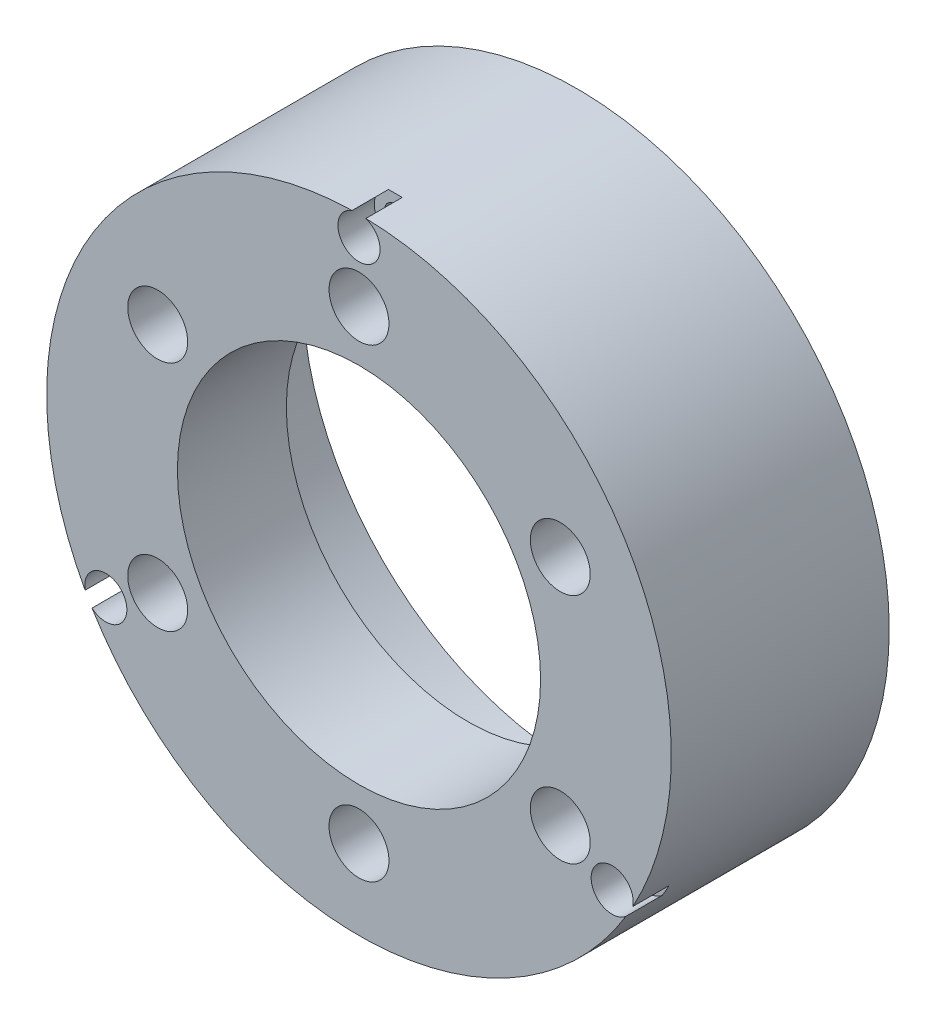
ISO-10303-21;
HEADER;
FILE_DESCRIPTION(('STEP AP214'),'2;1');
FILE_NAME('part.step','',(''),(''),'','','');
FILE_SCHEMA(('AUTOMOTIVE_DESIGN { 1 0 10303 214 1 1 1 1 }'));
ENDSEC;
DATA;
#1=APPLICATION_CONTEXT('core data for automotive mechanical design processes');
#2=APPLICATION_PROTOCOL_DEFINITION('international standard','automotive_design',2000,#1);
#3=PRODUCT_CONTEXT('',#1,'mechanical');
#4=PRODUCT('Part','Part','',(#3));
#5=PRODUCT_RELATED_PRODUCT_CATEGORY('part','',(#4));
#6=PRODUCT_DEFINITION_FORMATION('','',#4);
#7=PRODUCT_DEFINITION_CONTEXT('part definition',#1,'design');
#8=PRODUCT_DEFINITION('design','',#6,#7);
#9=PRODUCT_DEFINITION_SHAPE('','',#8);
#10=(LENGTH_UNIT() NAMED_UNIT(*) SI_UNIT(.MILLI.,.METRE.));
#11=(NAMED_UNIT(*) PLANE_ANGLE_UNIT() SI_UNIT($,.RADIAN.));
#12=(NAMED_UNIT(*) SI_UNIT($,.STERADIAN.) SOLID_ANGLE_UNIT());
#13=UNCERTAINTY_MEASURE_WITH_UNIT(LENGTH_MEASURE(1.E-05),#10,'distance_accuracy_value','');
#14=(GEOMETRIC_REPRESENTATION_CONTEXT(3) GLOBAL_UNCERTAINTY_ASSIGNED_CONTEXT((#13)) GLOBAL_UNIT_ASSIGNED_CONTEXT((#10,
#11,#12)) REPRESENTATION_CONTEXT('',''));
#15=CARTESIAN_POINT('',(0.,0.,0.));
#16=DIRECTION('',(0.,0.,1.));
#17=DIRECTION('',(1.,0.,0.));
#18=AXIS2_PLACEMENT_3D('',#15,#16,#17);
#19=CARTESIAN_POINT('',(0.,0.,30.));
#20=DIRECTION('',(0.,0.,-1.));
#21=DIRECTION('',(-1.,0.,0.));
#22=AXIS2_PLACEMENT_3D('',#19,#20,#21);
#23=CYLINDRICAL_SURFACE('',#22,25.);
#24=CARTESIAN_POINT('',(0.,0.,30.));
#25=DIRECTION('',(0.,0.,1.));
#26=DIRECTION('',(1.,0.,0.));
#27=AXIS2_PLACEMENT_3D('',#24,#25,#26);
#28=CIRCLE('',#27,25.);
#29=CARTESIAN_POINT('',(25.,0.,30.));
#30=VERTEX_POINT('',#29);
#31=EDGE_CURVE('E102',#30,#30,#28,.T.);
#32=ORIENTED_EDGE('',*,*,#31,.T.);
#33=EDGE_LOOP('',(#32));
#34=FACE_BOUND('',#33,.T.);
#35=CARTESIAN_POINT('',(0.,0.,15.));
#36=DIRECTION('',(0.,0.,-1.));
#37=DIRECTION('',(-1.,0.,0.));
#38=AXIS2_PLACEMENT_3D('',#35,#36,#37);
#39=CIRCLE('',#38,25.);
#40=CARTESIAN_POINT('',(-25.,0.,15.));
#41=VERTEX_POINT('',#40);
#42=EDGE_CURVE('E245',#41,#41,#39,.T.);
#43=ORIENTED_EDGE('',*,*,#42,.T.);
#44=EDGE_LOOP('',(#43));
#45=FACE_BOUND('',#44,.T.);
#46=ADVANCED_FACE('F17',(#34,#45),#23,.F.);
#47=CARTESIAN_POINT('',(-27.7128129211021,16.,0.));
#48=DIRECTION('',(0.,0.,1.));
#49=DIRECTION('',(1.,0.,0.));
#50=AXIS2_PLACEMENT_3D('',#47,#48,#49);
#51=CYLINDRICAL_SURFACE('',#50,4.125);
#52=CARTESIAN_POINT('',(-27.7128129211021,16.,30.));
#53=DIRECTION('',(0.,0.,1.));
#54=DIRECTION('',(1.,0.,0.));
#55=AXIS2_PLACEMENT_3D('',#52,#53,#54);
#56=CIRCLE('',#55,4.125);
#57=CARTESIAN_POINT('',(-23.5878129211021,16.,30.));
#58=VERTEX_POINT('',#57);
#59=EDGE_CURVE('E84',#58,#58,#56,.T.);
#60=ORIENTED_EDGE('',*,*,#59,.T.);
#61=EDGE_LOOP('',(#60));
#62=FACE_BOUND('',#61,.T.);
#63=CARTESIAN_POINT('',(-27.7128129211021,16.,15.));
#64=DIRECTION('',(0.,0.,-1.));
#65=DIRECTION('',(-1.,0.,0.));
#66=AXIS2_PLACEMENT_3D('',#63,#64,#65);
#67=CIRCLE('',#66,4.125);
#68=CARTESIAN_POINT('',(-31.8378129211021,16.,15.));
#69=VERTEX_POINT('',#68);
#70=EDGE_CURVE('E258',#69,#69,#67,.F.);
#71=ORIENTED_EDGE('',*,*,#70,.F.);
#72=EDGE_LOOP('',(#71));
#73=FACE_BOUND('',#72,.T.);
#74=ADVANCED_FACE('F154',(#62,#73),#51,.F.);
#75=CARTESIAN_POINT('',(-1.89948579573515E-12,32.0000000000031,0.));
#76=DIRECTION('',(0.,0.,1.));
#77=DIRECTION('',(1.,0.,0.));
#78=AXIS2_PLACEMENT_3D('',#75,#76,#77);
#79=CYLINDRICAL_SURFACE('',#78,4.12500000000352);
#80=CARTESIAN_POINT('',(-1.89948579573515E-12,32.0000000000031,30.));
#81=DIRECTION('',(0.,0.,1.));
#82=DIRECTION('',(1.,0.,0.));
#83=AXIS2_PLACEMENT_3D('',#80,#81,#82);
#84=CIRCLE('',#83,4.12500000000352);
#85=CARTESIAN_POINT('',(4.12500000000162,32.0000000000031,30.));
#86=VERTEX_POINT('',#85);
#87=EDGE_CURVE('E240',#86,#86,#84,.T.);
#88=ORIENTED_EDGE('',*,*,#87,.T.);
#89=EDGE_LOOP('',(#88));
#90=FACE_BOUND('',#89,.T.);
#91=CARTESIAN_POINT('',(-1.89948579573515E-12,32.0000000000031,15.));
#92=DIRECTION('',(0.,0.,-1.));
#93=DIRECTION('',(-1.,0.,0.));
#94=AXIS2_PLACEMENT_3D('',#91,#92,#93);
#95=CIRCLE('',#94,4.12500000000352);
#96=CARTESIAN_POINT('',(-4.12500000000542,32.0000000000031,15.));
#97=VERTEX_POINT('',#96);
#98=EDGE_CURVE('E261',#97,#97,#95,.F.);
#99=ORIENTED_EDGE('',*,*,#98,.F.);
#100=EDGE_LOOP('',(#99));
#101=FACE_BOUND('',#100,.T.);
#102=ADVANCED_FACE('F161',(#90,#101),#79,.F.);
#103=CARTESIAN_POINT('',(27.712812921102,16.0000000000063,0.));
#104=DIRECTION('',(0.,0.,1.));
#105=DIRECTION('',(1.,0.,0.));
#106=AXIS2_PLACEMENT_3D('',#103,#104,#105);
#107=CYLINDRICAL_SURFACE('',#106,4.12500000000624);
#108=CARTESIAN_POINT('',(27.712812921102,16.0000000000063,30.));
#109=DIRECTION('',(0.,0.,1.));
#110=DIRECTION('',(1.,0.,0.));
#111=AXIS2_PLACEMENT_3D('',#108,#109,#110);
#112=CIRCLE('',#111,4.12500000000624);
#113=CARTESIAN_POINT('',(31.8378129211082,16.0000000000063,30.));
#114=VERTEX_POINT('',#113);
#115=EDGE_CURVE('E251',#114,#114,#112,.T.);
#116=ORIENTED_EDGE('',*,*,#115,.T.);
#117=EDGE_LOOP('',(#116));
#118=FACE_BOUND('',#117,.T.);
#119=CARTESIAN_POINT('',(27.712812921102,16.0000000000063,15.));
#120=DIRECTION('',(0.,0.,-1.));
#121=DIRECTION('',(-1.,0.,0.));
#122=AXIS2_PLACEMENT_3D('',#119,#120,#121);
#123=CIRCLE('',#122,4.12500000000624);
#124=CARTESIAN_POINT('',(23.5878129210958,16.0000000000063,15.));
#125=VERTEX_POINT('',#124);
#126=EDGE_CURVE('E264',#125,#125,#123,.F.);
#127=ORIENTED_EDGE('',*,*,#126,.F.);
#128=EDGE_LOOP('',(#127));
#129=FACE_BOUND('',#128,.T.);
#130=ADVANCED_FACE('F287',(#118,#129),#107,.F.);
#131=CARTESIAN_POINT('',(27.7128129211057,-15.9999999999936,0.));
#132=DIRECTION('',(0.,0.,1.));
#133=DIRECTION('',(1.,0.,0.));
#134=AXIS2_PLACEMENT_3D('',#131,#132,#133);
#135=CYLINDRICAL_SURFACE('',#134,4.12500000000547);
#136=CARTESIAN_POINT('',(27.7128129211057,-15.9999999999936,30.));
#137=DIRECTION('',(0.,0.,1.));
#138=DIRECTION('',(1.,0.,0.));
#139=AXIS2_PLACEMENT_3D('',#136,#137,#138);
#140=CIRCLE('',#139,4.12500000000547);
#141=CARTESIAN_POINT('',(31.8378129211112,-15.9999999999936,30.));
#142=VERTEX_POINT('',#141);
#143=EDGE_CURVE('E248',#142,#142,#140,.T.);
#144=ORIENTED_EDGE('',*,*,#143,.T.);
#145=EDGE_LOOP('',(#144));
#146=FACE_BOUND('',#145,.T.);
#147=CARTESIAN_POINT('',(27.7128129211057,-15.9999999999936,15.));
#148=DIRECTION('',(0.,0.,-1.));
#149=DIRECTION('',(-1.,0.,0.));
#150=AXIS2_PLACEMENT_3D('',#147,#148,#149);
#151=CIRCLE('',#150,4.12500000000547);
#152=CARTESIAN_POINT('',(23.5878129211002,-15.9999999999936,15.));
#153=VERTEX_POINT('',#152);
#154=EDGE_CURVE('E267',#153,#153,#151,.F.);
#155=ORIENTED_EDGE('',*,*,#154,.F.);
#156=EDGE_LOOP('',(#155));
#157=FACE_BOUND('',#156,.T.);
#158=ADVANCED_FACE('F277',(#146,#157),#135,.F.);
#159=CARTESIAN_POINT('',(5.53619799844328E-12,-31.9999999999969,0.));
#160=DIRECTION('',(0.,0.,1.));
#161=DIRECTION('',(1.,0.,0.));
#162=AXIS2_PLACEMENT_3D('',#159,#160,#161);
#163=CYLINDRICAL_SURFACE('',#162,4.12500000000207);
#164=CARTESIAN_POINT('',(5.53619799844328E-12,-31.9999999999969,30.));
#165=DIRECTION('',(0.,0.,1.));
#166=DIRECTION('',(1.,0.,0.));
#167=AXIS2_PLACEMENT_3D('',#164,#165,#166);
#168=CIRCLE('',#167,4.12500000000207);
#169=CARTESIAN_POINT('',(4.12500000000761,-31.9999999999969,30.));
#170=VERTEX_POINT('',#169);
#171=EDGE_CURVE('E244',#170,#170,#168,.T.);
#172=ORIENTED_EDGE('',*,*,#171,.T.);
#173=EDGE_LOOP('',(#172));
#174=FACE_BOUND('',#173,.T.);
#175=CARTESIAN_POINT('',(5.53619799844328E-12,-31.9999999999969,15.));
#176=DIRECTION('',(0.,0.,-1.));
#177=DIRECTION('',(-1.,0.,0.));
#178=AXIS2_PLACEMENT_3D('',#175,#176,#177);
#179=CIRCLE('',#178,4.12500000000207);
#180=CARTESIAN_POINT('',(-4.12499999999654,-31.9999999999969,15.));
#181=VERTEX_POINT('',#180);
#182=EDGE_CURVE('E136',#181,#181,#179,.F.);
#183=ORIENTED_EDGE('',*,*,#182,.F.);
#184=EDGE_LOOP('',(#183));
#185=FACE_BOUND('',#184,.T.);
#186=ADVANCED_FACE('F275',(#174,#185),#163,.F.);
#187=CARTESIAN_POINT('',(-27.7128129210984,-16.,0.));
#188=DIRECTION('',(0.,0.,1.));
#189=DIRECTION('',(1.,0.,0.));
#190=AXIS2_PLACEMENT_3D('',#187,#188,#189);
#191=CYLINDRICAL_SURFACE('',#190,4.12499999999948);
#192=CARTESIAN_POINT('',(-27.7128129210984,-16.,30.));
#193=DIRECTION('',(0.,0.,1.));
#194=DIRECTION('',(1.,0.,0.));
#195=AXIS2_PLACEMENT_3D('',#192,#193,#194);
#196=CIRCLE('',#195,4.12499999999948);
#197=CARTESIAN_POINT('',(-23.5878129210989,-16.,30.));
#198=VERTEX_POINT('',#197);
#199=EDGE_CURVE('E241',#198,#198,#196,.T.);
#200=ORIENTED_EDGE('',*,*,#199,.T.);
#201=EDGE_LOOP('',(#200));
#202=FACE_BOUND('',#201,.T.);
#203=CARTESIAN_POINT('',(-27.7128129210984,-16.,15.));
#204=DIRECTION('',(0.,0.,-1.));
#205=DIRECTION('',(-1.,0.,0.));
#206=AXIS2_PLACEMENT_3D('',#203,#204,#205);
#207=CIRCLE('',#206,4.12499999999948);
#208=CARTESIAN_POINT('',(-31.8378129210978,-16.,15.));
#209=VERTEX_POINT('',#208);
#210=EDGE_CURVE('E134',#209,#209,#207,.F.);
#211=ORIENTED_EDGE('',*,*,#210,.F.);
#212=EDGE_LOOP('',(#211));
#213=FACE_BOUND('',#212,.T.);
#214=ADVANCED_FACE('F185',(#202,#213),#191,.F.);
#215=CARTESIAN_POINT('',(0.,40.25,10.));
#216=DIRECTION('',(0.,0.,-1.));
#217=DIRECTION('',(-1.,0.,0.));
#218=AXIS2_PLACEMENT_3D('',#215,#216,#217);
#219=CYLINDRICAL_SURFACE('',#218,1.5);
#220=CARTESIAN_POINT('',(0.,40.25,0.));
#221=DIRECTION('',(0.,0.,1.));
#222=DIRECTION('',(1.,0.,0.));
#223=AXIS2_PLACEMENT_3D('',#220,#221,#222);
#224=CIRCLE('',#223,1.5);
#225=CARTESIAN_POINT('',(1.5,40.25,0.));
#226=VERTEX_POINT('',#225);
#227=EDGE_CURVE('E116',#226,#226,#224,.T.);
#228=ORIENTED_EDGE('',*,*,#227,.F.);
#229=EDGE_LOOP('',(#228));
#230=FACE_BOUND('',#229,.T.);
#231=CARTESIAN_POINT('',(0.,40.25,25.));
#232=DIRECTION('',(0.,0.,1.));
#233=DIRECTION('',(1.,0.,0.));
#234=AXIS2_PLACEMENT_3D('',#231,#232,#233);
#235=CIRCLE('',#234,1.5);
#236=CARTESIAN_POINT('',(1.5,40.25,25.));
#237=VERTEX_POINT('',#236);
#238=EDGE_CURVE('E89',#237,#237,#235,.T.);
#239=ORIENTED_EDGE('',*,*,#238,.T.);
#240=EDGE_LOOP('',(#239));
#241=FACE_BOUND('',#240,.T.);
#242=ADVANCED_FACE('F181',(#230,#241),#219,.F.);
#243=CARTESIAN_POINT('',(-34.8575225023236,-20.125,10.));
#244=DIRECTION('',(0.,0.,-1.));
#245=DIRECTION('',(-1.,0.,0.));
#246=AXIS2_PLACEMENT_3D('',#243,#244,#245);
#247=CYLINDRICAL_SURFACE('',#246,1.5);
#248=CARTESIAN_POINT('',(-34.8575225023236,-20.125,0.));
#249=DIRECTION('',(0.,0.,1.));
#250=DIRECTION('',(1.,0.,0.));
#251=AXIS2_PLACEMENT_3D('',#248,#249,#250);
#252=CIRCLE('',#251,1.5);
#253=CARTESIAN_POINT('',(-33.3575225023236,-20.125,0.));
#254=VERTEX_POINT('',#253);
#255=EDGE_CURVE('E113',#254,#254,#252,.T.);
#256=ORIENTED_EDGE('',*,*,#255,.F.);
#257=EDGE_LOOP('',(#256));
#258=FACE_BOUND('',#257,.T.);
#259=CARTESIAN_POINT('',(-34.8575225023236,-20.125,25.));
#260=DIRECTION('',(0.,0.,1.));
#261=DIRECTION('',(1.,0.,0.));
#262=AXIS2_PLACEMENT_3D('',#259,#260,#261);
#263=CIRCLE('',#262,1.5);
#264=CARTESIAN_POINT('',(-33.3575225023236,-20.125,25.));
#265=VERTEX_POINT('',#264);
#266=EDGE_CURVE('E90',#265,#265,#263,.T.);
#267=ORIENTED_EDGE('',*,*,#266,.T.);
#268=EDGE_LOOP('',(#267));
#269=FACE_BOUND('',#268,.T.);
#270=ADVANCED_FACE('F177',(#258,#269),#247,.F.);
#271=CARTESIAN_POINT('',(34.8575225023236,-20.125,10.));
#272=DIRECTION('',(0.,0.,-1.));
#273=DIRECTION('',(-1.,0.,0.));
#274=AXIS2_PLACEMENT_3D('',#271,#272,#273);
#275=CYLINDRICAL_SURFACE('',#274,1.5);
#276=CARTESIAN_POINT('',(34.8575225023236,-20.125,0.));
#277=DIRECTION('',(0.,0.,1.));
#278=DIRECTION('',(1.,0.,0.));
#279=AXIS2_PLACEMENT_3D('',#276,#277,#278);
#280=CIRCLE('',#279,1.5);
#281=CARTESIAN_POINT('',(36.3575225023236,-20.125,0.));
#282=VERTEX_POINT('',#281);
#283=EDGE_CURVE('E110',#282,#282,#280,.T.);
#284=ORIENTED_EDGE('',*,*,#283,.F.);
#285=EDGE_LOOP('',(#284));
#286=FACE_BOUND('',#285,.T.);
#287=CARTESIAN_POINT('',(34.8575225023236,-20.125,25.));
#288=DIRECTION('',(0.,0.,1.));
#289=DIRECTION('',(1.,0.,0.));
#290=AXIS2_PLACEMENT_3D('',#287,#288,#289);
#291=CIRCLE('',#290,1.5);
#292=CARTESIAN_POINT('',(36.3575225023236,-20.125,25.));
#293=VERTEX_POINT('',#292);
#294=EDGE_CURVE('E130',#293,#293,#291,.T.);
#295=ORIENTED_EDGE('',*,*,#294,.T.);
#296=EDGE_LOOP('',(#295));
#297=FACE_BOUND('',#296,.T.);
#298=ADVANCED_FACE('F173',(#286,#297),#275,.F.);
#299=CARTESIAN_POINT('',(0.,0.,0.));
#300=DIRECTION('',(0.,0.,1.));
#301=DIRECTION('',(1.,0.,0.));
#302=AXIS2_PLACEMENT_3D('',#299,#300,#301);
#303=PLANE('',#302);
#304=CARTESIAN_POINT('',(0.,0.,0.));
#305=DIRECTION('',(0.,0.,1.));
#306=DIRECTION('',(1.,0.,0.));
#307=AXIS2_PLACEMENT_3D('',#304,#305,#306);
#308=CIRCLE('',#307,43.);
#309=CARTESIAN_POINT('',(43.,0.,0.));
#310=VERTEX_POINT('',#309);
#311=EDGE_CURVE('E122',#310,#310,#308,.T.);
#312=ORIENTED_EDGE('',*,*,#311,.F.);
#313=EDGE_LOOP('',(#312));
#314=FACE_BOUND('',#313,.T.);
#315=CARTESIAN_POINT('',(0.,0.,0.));
#316=DIRECTION('',(0.,0.,1.));
#317=DIRECTION('',(1.,0.,0.));
#318=AXIS2_PLACEMENT_3D('',#315,#316,#317);
#319=CIRCLE('',#318,37.75);
#320=CARTESIAN_POINT('',(37.75,0.,0.));
#321=VERTEX_POINT('',#320);
#322=EDGE_CURVE('E119',#321,#321,#319,.T.);
#323=ORIENTED_EDGE('',*,*,#322,.T.);
#324=EDGE_LOOP('',(#323));
#325=FACE_BOUND('',#324,.T.);
#326=ORIENTED_EDGE('',*,*,#227,.T.);
#327=EDGE_LOOP('',(#326));
#328=FACE_BOUND('',#327,.T.);
#329=ORIENTED_EDGE('',*,*,#255,.T.);
#330=EDGE_LOOP('',(#329));
#331=FACE_BOUND('',#330,.T.);
#332=ORIENTED_EDGE('',*,*,#283,.T.);
#333=EDGE_LOOP('',(#332));
#334=FACE_BOUND('',#333,.T.);
#335=ADVANCED_FACE('F176',(#314,#325,#328,#331,#334),#303,.F.);
#336=CARTESIAN_POINT('',(0.,0.,10.));
#337=DIRECTION('',(0.,0.,-1.));
#338=DIRECTION('',(-1.,0.,0.));
#339=AXIS2_PLACEMENT_3D('',#336,#337,#338);
#340=CYLINDRICAL_SURFACE('',#339,43.);
#341=ORIENTED_EDGE('',*,*,#311,.T.);
#342=EDGE_LOOP('',(#341));
#343=FACE_BOUND('',#342,.T.);
#344=CARTESIAN_POINT('',(0.,0.,25.));
#345=DIRECTION('',(0.,0.,1.));
#346=DIRECTION('',(1.,0.,0.));
#347=AXIS2_PLACEMENT_3D('',#344,#345,#346);
#348=CIRCLE('',#347,43.);
#349=CARTESIAN_POINT('',(0.951468806094219,42.9894720496894,25.));
#350=VERTEX_POINT('',#349);
#351=CARTESIAN_POINT('',(-0.951468806094219,42.9894720496894,25.));
#352=VERTEX_POINT('',#351);
#353=EDGE_CURVE('E93',#350,#352,#348,.T.);
#354=ORIENTED_EDGE('',*,*,#353,.F.);
#355=DIRECTION('',(0.,0.,1.));
#356=VECTOR('',#355,1.);
#357=CARTESIAN_POINT('',(0.951468806094389,42.9894720496894,27.5));
#358=LINE('',#357,#356);
#359=CARTESIAN_POINT('',(0.951468806094389,42.9894720496894,30.));
#360=VERTEX_POINT('',#359);
#361=EDGE_CURVE('E132',#350,#360,#358,.T.);
#362=ORIENTED_EDGE('',*,*,#361,.T.);
#363=CARTESIAN_POINT('',(0.,0.,30.));
#364=DIRECTION('',(0.,0.,1.));
#365=DIRECTION('',(1.,0.,0.));
#366=AXIS2_PLACEMENT_3D('',#363,#364,#365);
#367=CIRCLE('',#366,43.);
#368=CARTESIAN_POINT('',(37.7057092933592,-20.6707398678587,30.));
#369=VERTEX_POINT('',#368);
#370=EDGE_CURVE('E105',#369,#360,#367,.T.);
#371=ORIENTED_EDGE('',*,*,#370,.F.);
#372=DIRECTION('',(0.,0.,1.));
#373=VECTOR('',#372,1.);
#374=CARTESIAN_POINT('',(37.7057092933592,-20.6707398678587,27.5));
#375=LINE('',#374,#373);
#376=CARTESIAN_POINT('',(37.7057092933591,-20.6707398678588,25.));
#377=VERTEX_POINT('',#376);
#378=EDGE_CURVE('E32',#369,#377,#375,.F.);
#379=ORIENTED_EDGE('',*,*,#378,.T.);
#380=CARTESIAN_POINT('',(0.,0.,25.));
#381=DIRECTION('',(0.,0.,1.));
#382=DIRECTION('',(1.,0.,0.));
#383=AXIS2_PLACEMENT_3D('',#380,#381,#382);
#384=CIRCLE('',#383,43.);
#385=CARTESIAN_POINT('',(36.7542404872649,-22.3187321818309,25.));
#386=VERTEX_POINT('',#385);
#387=EDGE_CURVE('E96',#386,#377,#384,.T.);
#388=ORIENTED_EDGE('',*,*,#387,.F.);
#389=DIRECTION('',(0.,0.,1.));
#390=VECTOR('',#389,1.);
#391=CARTESIAN_POINT('',(36.7542404872648,-22.318732181831,27.5));
#392=LINE('',#391,#390);
#393=CARTESIAN_POINT('',(36.7542404872648,-22.318732181831,30.));
#394=VERTEX_POINT('',#393);
#395=EDGE_CURVE('E217',#386,#394,#392,.T.);
#396=ORIENTED_EDGE('',*,*,#395,.T.);
#397=CARTESIAN_POINT('',(-36.7542404872648,-22.3187321818311,30.));
#398=VERTEX_POINT('',#397);
#399=EDGE_CURVE('E108',#398,#394,#367,.T.);
#400=ORIENTED_EDGE('',*,*,#399,.F.);
#401=DIRECTION('',(0.,0.,1.));
#402=VECTOR('',#401,1.);
#403=CARTESIAN_POINT('',(-36.7542404872648,-22.318732181831,27.5));
#404=LINE('',#403,#402);
#405=CARTESIAN_POINT('',(-36.754240487265,-22.3187321818309,25.));
#406=VERTEX_POINT('',#405);
#407=EDGE_CURVE('E40',#398,#406,#404,.F.);
#408=ORIENTED_EDGE('',*,*,#407,.T.);
#409=CARTESIAN_POINT('',(0.,0.,25.));
#410=DIRECTION('',(0.,0.,1.));
#411=DIRECTION('',(1.,0.,0.));
#412=AXIS2_PLACEMENT_3D('',#409,#410,#411);
#413=CIRCLE('',#412,43.);
#414=CARTESIAN_POINT('',(-37.7057092933591,-20.6707398678589,25.));
#415=VERTEX_POINT('',#414);
#416=EDGE_CURVE('E82',#415,#406,#413,.T.);
#417=ORIENTED_EDGE('',*,*,#416,.F.);
#418=DIRECTION('',(0.,0.,1.));
#419=VECTOR('',#418,1.);
#420=CARTESIAN_POINT('',(-37.7057092933592,-20.6707398678587,27.5));
#421=LINE('',#420,#419);
#422=CARTESIAN_POINT('',(-37.7057092933592,-20.6707398678587,30.));
#423=VERTEX_POINT('',#422);
#424=EDGE_CURVE('E70',#415,#423,#421,.T.);
#425=ORIENTED_EDGE('',*,*,#424,.T.);
#426=CARTESIAN_POINT('',(-0.951468806094408,42.9894720496894,30.));
#427=VERTEX_POINT('',#426);
#428=EDGE_CURVE('E109',#427,#423,#367,.T.);
#429=ORIENTED_EDGE('',*,*,#428,.F.);
#430=DIRECTION('',(0.,0.,1.));
#431=VECTOR('',#430,1.);
#432=CARTESIAN_POINT('',(-0.951468806094389,42.9894720496894,27.5));
#433=LINE('',#432,#431);
#434=EDGE_CURVE('E223',#427,#352,#433,.F.);
#435=ORIENTED_EDGE('',*,*,#434,.T.);
#436=EDGE_LOOP('',(#354,#362,#371,#379,#388,#396,#400,#408,#417,#425,#429,#435));
#437=FACE_BOUND('',#436,.T.);
#438=ADVANCED_FACE('F87',(#343,#437),#340,.T.);
#439=CARTESIAN_POINT('',(0.,0.,10.));
#440=DIRECTION('',(0.,0.,-1.));
#441=DIRECTION('',(-1.,0.,0.));
#442=AXIS2_PLACEMENT_3D('',#439,#440,#441);
#443=CYLINDRICAL_SURFACE('',#442,37.75);
#444=CARTESIAN_POINT('',(0.,0.,14.));
#445=DIRECTION('',(0.,0.,-1.));
#446=DIRECTION('',(-1.,0.,0.));
#447=AXIS2_PLACEMENT_3D('',#444,#445,#446);
#448=CIRCLE('',#447,37.75);
#449=CARTESIAN_POINT('',(-37.75,0.,14.));
#450=VERTEX_POINT('',#449);
#451=EDGE_CURVE('E11',#450,#450,#448,.F.);
#452=ORIENTED_EDGE('',*,*,#451,.T.);
#453=EDGE_LOOP('',(#452));
#454=FACE_BOUND('',#453,.T.);
#455=ORIENTED_EDGE('',*,*,#322,.F.);
#456=EDGE_LOOP('',(#455));
#457=FACE_BOUND('',#456,.T.);
#458=ADVANCED_FACE('F171',(#454,#457),#443,.F.);
#459=CARTESIAN_POINT('',(0.,0.,30.));
#460=DIRECTION('',(0.,0.,1.));
#461=DIRECTION('',(1.,0.,0.));
#462=AXIS2_PLACEMENT_3D('',#459,#460,#461);
#463=PLANE('',#462);
#464=ORIENTED_EDGE('',*,*,#199,.F.);
#465=EDGE_LOOP('',(#464));
#466=FACE_BOUND('',#465,.T.);
#467=ORIENTED_EDGE('',*,*,#171,.F.);
#468=EDGE_LOOP('',(#467));
#469=FACE_BOUND('',#468,.T.);
#470=ORIENTED_EDGE('',*,*,#143,.F.);
#471=EDGE_LOOP('',(#470));
#472=FACE_BOUND('',#471,.T.);
#473=ORIENTED_EDGE('',*,*,#115,.F.);
#474=EDGE_LOOP('',(#473));
#475=FACE_BOUND('',#474,.T.);
#476=ORIENTED_EDGE('',*,*,#87,.F.);
#477=EDGE_LOOP('',(#476));
#478=FACE_BOUND('',#477,.T.);
#479=ORIENTED_EDGE('',*,*,#59,.F.);
#480=EDGE_LOOP('',(#479));
#481=FACE_BOUND('',#480,.T.);
#482=CARTESIAN_POINT('',(0.,40.25,30.));
#483=DIRECTION('',(0.,0.,1.));
#484=DIRECTION('',(1.,0.,0.));
#485=AXIS2_PLACEMENT_3D('',#482,#483,#484);
#486=CIRCLE('',#485,2.9);
#487=EDGE_CURVE('E128',#427,#360,#486,.T.);
#488=ORIENTED_EDGE('',*,*,#487,.F.);
#489=ORIENTED_EDGE('',*,*,#428,.T.);
#490=CARTESIAN_POINT('',(-34.8575225023236,-20.125,30.));
#491=DIRECTION('',(0.,0.,1.));
#492=DIRECTION('',(1.,0.,0.));
#493=AXIS2_PLACEMENT_3D('',#490,#491,#492);
#494=CIRCLE('',#493,2.9);
#495=EDGE_CURVE('E74',#398,#423,#494,.T.);
#496=ORIENTED_EDGE('',*,*,#495,.F.);
#497=ORIENTED_EDGE('',*,*,#399,.T.);
#498=CARTESIAN_POINT('',(34.8575225023236,-20.125,30.));
#499=DIRECTION('',(0.,0.,1.));
#500=DIRECTION('',(1.,0.,0.));
#501=AXIS2_PLACEMENT_3D('',#498,#499,#500);
#502=CIRCLE('',#501,2.9);
#503=EDGE_CURVE('E126',#369,#394,#502,.T.);
#504=ORIENTED_EDGE('',*,*,#503,.F.);
#505=ORIENTED_EDGE('',*,*,#370,.T.);
#506=EDGE_LOOP('',(#488,#489,#496,#497,#504,#505));
#507=FACE_BOUND('',#506,.T.);
#508=ORIENTED_EDGE('',*,*,#31,.F.);
#509=EDGE_LOOP('',(#508));
#510=FACE_BOUND('',#509,.T.);
#511=ADVANCED_FACE('F168',(#466,#469,#472,#475,#478,#481,#507,#510),#463,.T.);
#512=CARTESIAN_POINT('',(-34.8575225023236,-20.125,25.));
#513=DIRECTION('',(0.,0.,1.));
#514=DIRECTION('',(1.,0.,0.));
#515=AXIS2_PLACEMENT_3D('',#512,#513,#514);
#516=PLANE('',#515);
#517=ORIENTED_EDGE('',*,*,#266,.F.);
#518=EDGE_LOOP('',(#517));
#519=FACE_BOUND('',#518,.T.);
#520=ORIENTED_EDGE('',*,*,#416,.T.);
#521=CARTESIAN_POINT('',(-34.8575225023236,-20.125,25.));
#522=DIRECTION('',(0.,0.,1.));
#523=DIRECTION('',(1.,0.,0.));
#524=AXIS2_PLACEMENT_3D('',#521,#522,#523);
#525=CIRCLE('',#524,2.9);
#526=EDGE_CURVE('E73',#406,#415,#525,.T.);
#527=ORIENTED_EDGE('',*,*,#526,.T.);
#528=EDGE_LOOP('',(#520,#527));
#529=FACE_BOUND('',#528,.T.);
#530=ADVANCED_FACE('F81',(#519,#529),#516,.T.);
#531=CARTESIAN_POINT('',(-34.8575225023236,-20.125,25.));
#532=DIRECTION('',(0.,0.,1.));
#533=DIRECTION('',(1.,0.,0.));
#534=AXIS2_PLACEMENT_3D('',#531,#532,#533);
#535=CYLINDRICAL_SURFACE('',#534,2.9);
#536=ORIENTED_EDGE('',*,*,#526,.F.);
#537=ORIENTED_EDGE('',*,*,#407,.F.);
#538=ORIENTED_EDGE('',*,*,#495,.T.);
#539=ORIENTED_EDGE('',*,*,#424,.F.);
#540=EDGE_LOOP('',(#536,#537,#538,#539));
#541=FACE_BOUND('',#540,.T.);
#542=ADVANCED_FACE('F72',(#541),#535,.F.);
#543=CARTESIAN_POINT('',(34.8575225023236,-20.125,25.));
#544=DIRECTION('',(0.,0.,1.));
#545=DIRECTION('',(1.,0.,0.));
#546=AXIS2_PLACEMENT_3D('',#543,#544,#545);
#547=PLANE('',#546);
#548=ORIENTED_EDGE('',*,*,#294,.F.);
#549=EDGE_LOOP('',(#548));
#550=FACE_BOUND('',#549,.T.);
#551=ORIENTED_EDGE('',*,*,#387,.T.);
#552=CARTESIAN_POINT('',(34.8575225023236,-20.125,25.));
#553=DIRECTION('',(0.,0.,1.));
#554=DIRECTION('',(1.,0.,0.));
#555=AXIS2_PLACEMENT_3D('',#552,#553,#554);
#556=CIRCLE('',#555,2.9);
#557=EDGE_CURVE('E83',#377,#386,#556,.T.);
#558=ORIENTED_EDGE('',*,*,#557,.T.);
#559=EDGE_LOOP('',(#551,#558));
#560=FACE_BOUND('',#559,.T.);
#561=ADVANCED_FACE('F209',(#550,#560),#547,.T.);
#562=CARTESIAN_POINT('',(34.8575225023236,-20.125,25.));
#563=DIRECTION('',(0.,0.,1.));
#564=DIRECTION('',(1.,0.,0.));
#565=AXIS2_PLACEMENT_3D('',#562,#563,#564);
#566=CYLINDRICAL_SURFACE('',#565,2.9);
#567=ORIENTED_EDGE('',*,*,#557,.F.);
#568=ORIENTED_EDGE('',*,*,#378,.F.);
#569=ORIENTED_EDGE('',*,*,#503,.T.);
#570=ORIENTED_EDGE('',*,*,#395,.F.);
#571=EDGE_LOOP('',(#567,#568,#569,#570));
#572=FACE_BOUND('',#571,.T.);
#573=ADVANCED_FACE('F212',(#572),#566,.F.);
#574=CARTESIAN_POINT('',(0.,40.25,25.));
#575=DIRECTION('',(0.,0.,1.));
#576=DIRECTION('',(1.,0.,0.));
#577=AXIS2_PLACEMENT_3D('',#574,#575,#576);
#578=PLANE('',#577);
#579=ORIENTED_EDGE('',*,*,#238,.F.);
#580=EDGE_LOOP('',(#579));
#581=FACE_BOUND('',#580,.T.);
#582=ORIENTED_EDGE('',*,*,#353,.T.);
#583=CARTESIAN_POINT('',(0.,40.25,25.));
#584=DIRECTION('',(0.,0.,1.));
#585=DIRECTION('',(1.,0.,0.));
#586=AXIS2_PLACEMENT_3D('',#583,#584,#585);
#587=CIRCLE('',#586,2.9);
#588=EDGE_CURVE('E218',#352,#350,#587,.T.);
#589=ORIENTED_EDGE('',*,*,#588,.T.);
#590=EDGE_LOOP('',(#582,#589));
#591=FACE_BOUND('',#590,.T.);
#592=ADVANCED_FACE('F292',(#581,#591),#578,.T.);
#593=CARTESIAN_POINT('',(0.,40.25,25.));
#594=DIRECTION('',(0.,0.,1.));
#595=DIRECTION('',(1.,0.,0.));
#596=AXIS2_PLACEMENT_3D('',#593,#594,#595);
#597=CYLINDRICAL_SURFACE('',#596,2.9);
#598=ORIENTED_EDGE('',*,*,#588,.F.);
#599=ORIENTED_EDGE('',*,*,#434,.F.);
#600=ORIENTED_EDGE('',*,*,#487,.T.);
#601=ORIENTED_EDGE('',*,*,#361,.F.);
#602=EDGE_LOOP('',(#598,#599,#600,#601));
#603=FACE_BOUND('',#602,.T.);
#604=ADVANCED_FACE('F150',(#603),#597,.F.);
#605=CARTESIAN_POINT('',(0.,0.,15.));
#606=DIRECTION('',(0.,0.,-1.));
#607=DIRECTION('',(-1.,0.,0.));
#608=AXIS2_PLACEMENT_3D('',#605,#606,#607);
#609=PLANE('',#608);
#610=CARTESIAN_POINT('',(0.,0.,15.));
#611=DIRECTION('',(0.,0.,-1.));
#612=DIRECTION('',(-1.,0.,0.));
#613=AXIS2_PLACEMENT_3D('',#610,#611,#612);
#614=CIRCLE('',#613,36.75);
#615=CARTESIAN_POINT('',(-36.75,0.,15.));
#616=VERTEX_POINT('',#615);
#617=EDGE_CURVE('E25',#616,#616,#614,.T.);
#618=ORIENTED_EDGE('',*,*,#617,.T.);
#619=EDGE_LOOP('',(#618));
#620=FACE_BOUND('',#619,.T.);
#621=ORIENTED_EDGE('',*,*,#42,.F.);
#622=EDGE_LOOP('',(#621));
#623=FACE_BOUND('',#622,.T.);
#624=ORIENTED_EDGE('',*,*,#210,.T.);
#625=EDGE_LOOP('',(#624));
#626=FACE_BOUND('',#625,.T.);
#627=ORIENTED_EDGE('',*,*,#182,.T.);
#628=EDGE_LOOP('',(#627));
#629=FACE_BOUND('',#628,.T.);
#630=ORIENTED_EDGE('',*,*,#154,.T.);
#631=EDGE_LOOP('',(#630));
#632=FACE_BOUND('',#631,.T.);
#633=ORIENTED_EDGE('',*,*,#126,.T.);
#634=EDGE_LOOP('',(#633));
#635=FACE_BOUND('',#634,.T.);
#636=ORIENTED_EDGE('',*,*,#98,.T.);
#637=EDGE_LOOP('',(#636));
#638=FACE_BOUND('',#637,.T.);
#639=ORIENTED_EDGE('',*,*,#70,.T.);
#640=EDGE_LOOP('',(#639));
#641=FACE_BOUND('',#640,.T.);
#642=ADVANCED_FACE('F140',(#620,#623,#626,#629,#632,#635,#638,#641),#609,.T.);
#643=CARTESIAN_POINT('',(0.,0.,14.));
#644=DIRECTION('',(0.,0.,-1.));
#645=DIRECTION('',(-1.,0.,0.));
#646=AXIS2_PLACEMENT_3D('',#643,#644,#645);
#647=TOROIDAL_SURFACE('',#646,36.75,1.);
#648=ORIENTED_EDGE('',*,*,#451,.F.);
#649=EDGE_LOOP('',(#648));
#650=FACE_BOUND('',#649,.T.);
#651=ORIENTED_EDGE('',*,*,#617,.F.);
#652=EDGE_LOOP('',(#651));
#653=FACE_BOUND('',#652,.T.);
#654=ADVANCED_FACE('F19',(#650,#653),#647,.F.);
#655=CLOSED_SHELL('',(#46,#74,#102,#130,#158,#186,#214,#242,#270,#298,#335,#438,#458,#511,#530,
#542,#561,#573,#592,#604,#642,#654));
#656=MANIFOLD_SOLID_BREP('B1',#655);
#657=ADVANCED_BREP_SHAPE_REPRESENTATION('',(#18,#656),#14);
#658=SHAPE_DEFINITION_REPRESENTATION(#9,#657);
ENDSEC;
END-ISO-10303-21;
